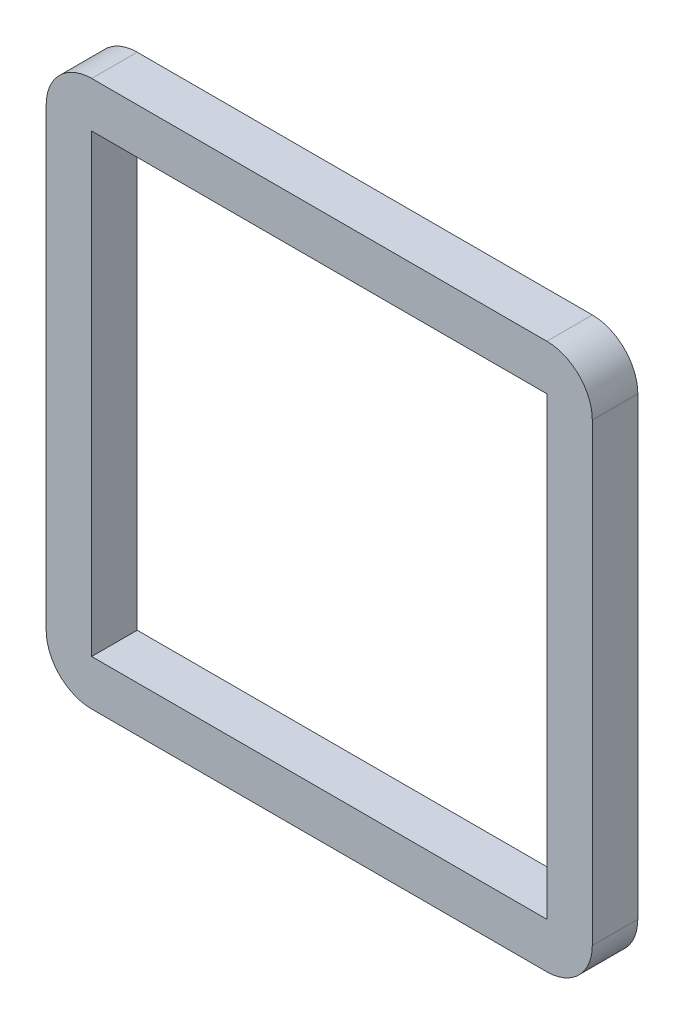
ISO-10303-21;
HEADER;
FILE_DESCRIPTION(('STEP AP214'),'2;1');
FILE_NAME('part.step','',(''),(''),'','','');
FILE_SCHEMA(('AUTOMOTIVE_DESIGN { 1 0 10303 214 1 1 1 1 }'));
ENDSEC;
DATA;
#1=APPLICATION_CONTEXT('core data for automotive mechanical design processes');
#2=APPLICATION_PROTOCOL_DEFINITION('international standard','automotive_design',2000,#1);
#3=PRODUCT_CONTEXT('',#1,'mechanical');
#4=PRODUCT('Part','Part','',(#3));
#5=PRODUCT_RELATED_PRODUCT_CATEGORY('part','',(#4));
#6=PRODUCT_DEFINITION_FORMATION('','',#4);
#7=PRODUCT_DEFINITION_CONTEXT('part definition',#1,'design');
#8=PRODUCT_DEFINITION('design','',#6,#7);
#9=PRODUCT_DEFINITION_SHAPE('','',#8);
#10=(LENGTH_UNIT() NAMED_UNIT(*) SI_UNIT(.MILLI.,.METRE.));
#11=(NAMED_UNIT(*) PLANE_ANGLE_UNIT() SI_UNIT($,.RADIAN.));
#12=(NAMED_UNIT(*) SI_UNIT($,.STERADIAN.) SOLID_ANGLE_UNIT());
#13=UNCERTAINTY_MEASURE_WITH_UNIT(LENGTH_MEASURE(1.E-05),#10,'distance_accuracy_value','');
#14=(GEOMETRIC_REPRESENTATION_CONTEXT(3) GLOBAL_UNCERTAINTY_ASSIGNED_CONTEXT((#13)) GLOBAL_UNIT_ASSIGNED_CONTEXT((#10,
#11,#12)) REPRESENTATION_CONTEXT('',''));
#15=CARTESIAN_POINT('',(0.,0.,0.));
#16=DIRECTION('',(0.,0.,1.));
#17=DIRECTION('',(1.,0.,0.));
#18=AXIS2_PLACEMENT_3D('',#15,#16,#17);
#19=CARTESIAN_POINT('',(-49.9999999999999,60.,10.));
#20=DIRECTION('',(0.,1.,0.));
#21=DIRECTION('',(0.,0.,1.));
#22=AXIS2_PLACEMENT_3D('',#19,#20,#21);
#23=PLANE('',#22);
#24=DIRECTION('',(1.,0.,0.));
#25=VECTOR('',#24,1.);
#26=CARTESIAN_POINT('',(-49.9999999999999,60.,0.));
#27=LINE('',#26,#25);
#28=CARTESIAN_POINT('',(-49.9999999999999,60.,0.));
#29=VERTEX_POINT('',#28);
#30=CARTESIAN_POINT('',(49.9999999999999,60.,0.));
#31=VERTEX_POINT('',#30);
#32=EDGE_CURVE('E155',#29,#31,#27,.T.);
#33=ORIENTED_EDGE('',*,*,#32,.F.);
#34=DIRECTION('',(0.,0.,-1.));
#35=VECTOR('',#34,1.);
#36=CARTESIAN_POINT('',(-49.9999999999999,60.,10.));
#37=LINE('',#36,#35);
#38=CARTESIAN_POINT('',(-49.9999999999999,60.,10.));
#39=VERTEX_POINT('',#38);
#40=EDGE_CURVE('E11',#39,#29,#37,.T.);
#41=ORIENTED_EDGE('',*,*,#40,.F.);
#42=DIRECTION('',(1.,0.,0.));
#43=VECTOR('',#42,1.);
#44=CARTESIAN_POINT('',(-49.9999999999999,60.,10.));
#45=LINE('',#44,#43);
#46=CARTESIAN_POINT('',(49.9999999999999,60.,10.));
#47=VERTEX_POINT('',#46);
#48=EDGE_CURVE('E159',#39,#47,#45,.T.);
#49=ORIENTED_EDGE('',*,*,#48,.T.);
#50=DIRECTION('',(0.,0.,-1.));
#51=VECTOR('',#50,1.);
#52=CARTESIAN_POINT('',(49.9999999999999,60.,10.));
#53=LINE('',#52,#51);
#54=EDGE_CURVE('E36',#47,#31,#53,.T.);
#55=ORIENTED_EDGE('',*,*,#54,.T.);
#56=EDGE_LOOP('',(#33,#41,#49,#55));
#57=FACE_BOUND('',#56,.T.);
#58=ADVANCED_FACE('F33',(#57),#23,.T.);
#59=CARTESIAN_POINT('',(-50.,50.,10.));
#60=DIRECTION('',(0.,0.,-1.));
#61=DIRECTION('',(-1.,0.,0.));
#62=AXIS2_PLACEMENT_3D('',#59,#60,#61);
#63=CYLINDRICAL_SURFACE('',#62,10.);
#64=CARTESIAN_POINT('',(-50.,50.,0.));
#65=DIRECTION('',(0.,0.,1.));
#66=DIRECTION('',(1.,0.,0.));
#67=AXIS2_PLACEMENT_3D('',#64,#65,#66);
#68=CIRCLE('',#67,10.);
#69=CARTESIAN_POINT('',(-60.,49.9999999999999,0.));
#70=VERTEX_POINT('',#69);
#71=EDGE_CURVE('E163',#29,#70,#68,.T.);
#72=ORIENTED_EDGE('',*,*,#71,.T.);
#73=DIRECTION('',(0.,0.,-1.));
#74=VECTOR('',#73,1.);
#75=CARTESIAN_POINT('',(-60.,49.9999999999999,10.));
#76=LINE('',#75,#74);
#77=CARTESIAN_POINT('',(-60.,49.9999999999999,10.));
#78=VERTEX_POINT('',#77);
#79=EDGE_CURVE('E41',#78,#70,#76,.T.);
#80=ORIENTED_EDGE('',*,*,#79,.F.);
#81=CARTESIAN_POINT('',(-50.,50.,10.));
#82=DIRECTION('',(0.,0.,1.));
#83=DIRECTION('',(1.,0.,0.));
#84=AXIS2_PLACEMENT_3D('',#81,#82,#83);
#85=CIRCLE('',#84,10.);
#86=EDGE_CURVE('E177',#39,#78,#85,.T.);
#87=ORIENTED_EDGE('',*,*,#86,.F.);
#88=ORIENTED_EDGE('',*,*,#40,.T.);
#89=EDGE_LOOP('',(#72,#80,#87,#88));
#90=FACE_BOUND('',#89,.T.);
#91=ADVANCED_FACE('F223',(#90),#63,.T.);
#92=CARTESIAN_POINT('',(-60.,49.9999999999999,10.));
#93=DIRECTION('',(1.,0.,0.));
#94=DIRECTION('',(0.,1.,0.));
#95=AXIS2_PLACEMENT_3D('',#92,#93,#94);
#96=PLANE('',#95);
#97=DIRECTION('',(0.,-1.,0.));
#98=VECTOR('',#97,1.);
#99=CARTESIAN_POINT('',(-60.,49.9999999999999,0.));
#100=LINE('',#99,#98);
#101=CARTESIAN_POINT('',(-60.,-49.9999999999999,0.));
#102=VERTEX_POINT('',#101);
#103=EDGE_CURVE('E194',#70,#102,#100,.T.);
#104=ORIENTED_EDGE('',*,*,#103,.T.);
#105=DIRECTION('',(0.,0.,-1.));
#106=VECTOR('',#105,1.);
#107=CARTESIAN_POINT('',(-60.,-49.9999999999999,10.));
#108=LINE('',#107,#106);
#109=CARTESIAN_POINT('',(-60.,-49.9999999999999,10.));
#110=VERTEX_POINT('',#109);
#111=EDGE_CURVE('E199',#110,#102,#108,.T.);
#112=ORIENTED_EDGE('',*,*,#111,.F.);
#113=DIRECTION('',(0.,-1.,0.));
#114=VECTOR('',#113,1.);
#115=CARTESIAN_POINT('',(-60.,49.9999999999999,10.));
#116=LINE('',#115,#114);
#117=EDGE_CURVE('E175',#78,#110,#116,.T.);
#118=ORIENTED_EDGE('',*,*,#117,.F.);
#119=ORIENTED_EDGE('',*,*,#79,.T.);
#120=EDGE_LOOP('',(#104,#112,#118,#119));
#121=FACE_BOUND('',#120,.T.);
#122=ADVANCED_FACE('F227',(#121),#96,.F.);
#123=CARTESIAN_POINT('',(-50.,-50.,10.));
#124=DIRECTION('',(0.,0.,-1.));
#125=DIRECTION('',(-1.,0.,0.));
#126=AXIS2_PLACEMENT_3D('',#123,#124,#125);
#127=CYLINDRICAL_SURFACE('',#126,10.);
#128=CARTESIAN_POINT('',(-50.,-50.,0.));
#129=DIRECTION('',(0.,0.,1.));
#130=DIRECTION('',(1.,0.,0.));
#131=AXIS2_PLACEMENT_3D('',#128,#129,#130);
#132=CIRCLE('',#131,10.);
#133=CARTESIAN_POINT('',(-49.9999999999999,-60.,0.));
#134=VERTEX_POINT('',#133);
#135=EDGE_CURVE('E192',#102,#134,#132,.T.);
#136=ORIENTED_EDGE('',*,*,#135,.T.);
#137=DIRECTION('',(0.,0.,-1.));
#138=VECTOR('',#137,1.);
#139=CARTESIAN_POINT('',(-49.9999999999999,-60.,10.));
#140=LINE('',#139,#138);
#141=CARTESIAN_POINT('',(-49.9999999999999,-60.,10.));
#142=VERTEX_POINT('',#141);
#143=EDGE_CURVE('E202',#142,#134,#140,.T.);
#144=ORIENTED_EDGE('',*,*,#143,.F.);
#145=CARTESIAN_POINT('',(-50.,-50.,10.));
#146=DIRECTION('',(0.,0.,1.));
#147=DIRECTION('',(1.,0.,0.));
#148=AXIS2_PLACEMENT_3D('',#145,#146,#147);
#149=CIRCLE('',#148,10.);
#150=EDGE_CURVE('E173',#110,#142,#149,.T.);
#151=ORIENTED_EDGE('',*,*,#150,.F.);
#152=ORIENTED_EDGE('',*,*,#111,.T.);
#153=EDGE_LOOP('',(#136,#144,#151,#152));
#154=FACE_BOUND('',#153,.T.);
#155=ADVANCED_FACE('F247',(#154),#127,.T.);
#156=CARTESIAN_POINT('',(-49.9999999999999,-60.,10.));
#157=DIRECTION('',(0.,1.,0.));
#158=DIRECTION('',(0.,0.,1.));
#159=AXIS2_PLACEMENT_3D('',#156,#157,#158);
#160=PLANE('',#159);
#161=DIRECTION('',(1.,0.,0.));
#162=VECTOR('',#161,1.);
#163=CARTESIAN_POINT('',(-49.9999999999999,-60.,0.));
#164=LINE('',#163,#162);
#165=CARTESIAN_POINT('',(49.9999999999999,-60.,0.));
#166=VERTEX_POINT('',#165);
#167=EDGE_CURVE('E190',#134,#166,#164,.T.);
#168=ORIENTED_EDGE('',*,*,#167,.T.);
#169=DIRECTION('',(0.,0.,-1.));
#170=VECTOR('',#169,1.);
#171=CARTESIAN_POINT('',(49.9999999999999,-60.,10.));
#172=LINE('',#171,#170);
#173=CARTESIAN_POINT('',(49.9999999999999,-60.,10.));
#174=VERTEX_POINT('',#173);
#175=EDGE_CURVE('E205',#174,#166,#172,.T.);
#176=ORIENTED_EDGE('',*,*,#175,.F.);
#177=DIRECTION('',(1.,0.,0.));
#178=VECTOR('',#177,1.);
#179=CARTESIAN_POINT('',(-49.9999999999999,-60.,10.));
#180=LINE('',#179,#178);
#181=EDGE_CURVE('E171',#142,#174,#180,.T.);
#182=ORIENTED_EDGE('',*,*,#181,.F.);
#183=ORIENTED_EDGE('',*,*,#143,.T.);
#184=EDGE_LOOP('',(#168,#176,#182,#183));
#185=FACE_BOUND('',#184,.T.);
#186=ADVANCED_FACE('F245',(#185),#160,.F.);
#187=CARTESIAN_POINT('',(50.,-50.,10.));
#188=DIRECTION('',(0.,0.,-1.));
#189=DIRECTION('',(-1.,0.,0.));
#190=AXIS2_PLACEMENT_3D('',#187,#188,#189);
#191=CYLINDRICAL_SURFACE('',#190,10.);
#192=CARTESIAN_POINT('',(50.,-50.,0.));
#193=DIRECTION('',(0.,0.,1.));
#194=DIRECTION('',(1.,0.,0.));
#195=AXIS2_PLACEMENT_3D('',#192,#193,#194);
#196=CIRCLE('',#195,10.);
#197=CARTESIAN_POINT('',(60.,-50.,0.));
#198=VERTEX_POINT('',#197);
#199=EDGE_CURVE('E187',#166,#198,#196,.T.);
#200=ORIENTED_EDGE('',*,*,#199,.T.);
#201=DIRECTION('',(0.,0.,-1.));
#202=VECTOR('',#201,1.);
#203=CARTESIAN_POINT('',(60.,-50.,10.));
#204=LINE('',#203,#202);
#205=CARTESIAN_POINT('',(60.,-50.,10.));
#206=VERTEX_POINT('',#205);
#207=EDGE_CURVE('E208',#206,#198,#204,.T.);
#208=ORIENTED_EDGE('',*,*,#207,.F.);
#209=CARTESIAN_POINT('',(50.,-50.,10.));
#210=DIRECTION('',(0.,0.,1.));
#211=DIRECTION('',(1.,0.,0.));
#212=AXIS2_PLACEMENT_3D('',#209,#210,#211);
#213=CIRCLE('',#212,10.);
#214=EDGE_CURVE('E169',#174,#206,#213,.T.);
#215=ORIENTED_EDGE('',*,*,#214,.F.);
#216=ORIENTED_EDGE('',*,*,#175,.T.);
#217=EDGE_LOOP('',(#200,#208,#215,#216));
#218=FACE_BOUND('',#217,.T.);
#219=ADVANCED_FACE('F241',(#218),#191,.T.);
#220=CARTESIAN_POINT('',(60.,49.9999999999999,10.));
#221=DIRECTION('',(1.,0.,0.));
#222=DIRECTION('',(0.,1.,0.));
#223=AXIS2_PLACEMENT_3D('',#220,#221,#222);
#224=PLANE('',#223);
#225=DIRECTION('',(0.,-1.,0.));
#226=VECTOR('',#225,1.);
#227=CARTESIAN_POINT('',(60.,49.9999999999999,0.));
#228=LINE('',#227,#226);
#229=CARTESIAN_POINT('',(60.,49.9999999999999,0.));
#230=VERTEX_POINT('',#229);
#231=EDGE_CURVE('E184',#230,#198,#228,.T.);
#232=ORIENTED_EDGE('',*,*,#231,.F.);
#233=DIRECTION('',(0.,0.,-1.));
#234=VECTOR('',#233,1.);
#235=CARTESIAN_POINT('',(60.,49.9999999999999,10.));
#236=LINE('',#235,#234);
#237=CARTESIAN_POINT('',(60.,49.9999999999999,10.));
#238=VERTEX_POINT('',#237);
#239=EDGE_CURVE('E209',#238,#230,#236,.T.);
#240=ORIENTED_EDGE('',*,*,#239,.F.);
#241=DIRECTION('',(0.,-1.,0.));
#242=VECTOR('',#241,1.);
#243=CARTESIAN_POINT('',(60.,49.9999999999999,10.));
#244=LINE('',#243,#242);
#245=EDGE_CURVE('E166',#238,#206,#244,.T.);
#246=ORIENTED_EDGE('',*,*,#245,.T.);
#247=ORIENTED_EDGE('',*,*,#207,.T.);
#248=EDGE_LOOP('',(#232,#240,#246,#247));
#249=FACE_BOUND('',#248,.T.);
#250=ADVANCED_FACE('F237',(#249),#224,.T.);
#251=CARTESIAN_POINT('',(50.,50.,10.));
#252=DIRECTION('',(0.,0.,-1.));
#253=DIRECTION('',(-1.,0.,0.));
#254=AXIS2_PLACEMENT_3D('',#251,#252,#253);
#255=CYLINDRICAL_SURFACE('',#254,10.);
#256=CARTESIAN_POINT('',(50.,50.,0.));
#257=DIRECTION('',(0.,0.,-1.));
#258=DIRECTION('',(-1.,0.,0.));
#259=AXIS2_PLACEMENT_3D('',#256,#257,#258);
#260=CIRCLE('',#259,10.);
#261=EDGE_CURVE('E181',#31,#230,#260,.T.);
#262=ORIENTED_EDGE('',*,*,#261,.F.);
#263=ORIENTED_EDGE('',*,*,#54,.F.);
#264=CARTESIAN_POINT('',(50.,50.,10.));
#265=DIRECTION('',(0.,0.,-1.));
#266=DIRECTION('',(-1.,0.,0.));
#267=AXIS2_PLACEMENT_3D('',#264,#265,#266);
#268=CIRCLE('',#267,10.);
#269=EDGE_CURVE('E162',#47,#238,#268,.T.);
#270=ORIENTED_EDGE('',*,*,#269,.T.);
#271=ORIENTED_EDGE('',*,*,#239,.T.);
#272=EDGE_LOOP('',(#262,#263,#270,#271));
#273=FACE_BOUND('',#272,.T.);
#274=ADVANCED_FACE('F217',(#273),#255,.T.);
#275=CARTESIAN_POINT('',(50.,50.,10.));
#276=DIRECTION('',(0.,0.,-1.));
#277=DIRECTION('',(-1.,0.,0.));
#278=AXIS2_PLACEMENT_3D('',#275,#276,#277);
#279=PLANE('',#278);
#280=DIRECTION('',(-1.,0.,0.));
#281=VECTOR('',#280,1.);
#282=CARTESIAN_POINT('',(-50.,50.,10.));
#283=LINE('',#282,#281);
#284=CARTESIAN_POINT('',(50.,50.,10.));
#285=VERTEX_POINT('',#284);
#286=CARTESIAN_POINT('',(-50.,50.,10.));
#287=VERTEX_POINT('',#286);
#288=EDGE_CURVE('E149',#285,#287,#283,.T.);
#289=ORIENTED_EDGE('',*,*,#288,.F.);
#290=DIRECTION('',(0.,1.,0.));
#291=VECTOR('',#290,1.);
#292=CARTESIAN_POINT('',(50.,50.,10.));
#293=LINE('',#292,#291);
#294=CARTESIAN_POINT('',(50.,-50.,10.));
#295=VERTEX_POINT('',#294);
#296=EDGE_CURVE('E49',#295,#285,#293,.T.);
#297=ORIENTED_EDGE('',*,*,#296,.F.);
#298=DIRECTION('',(1.,0.,0.));
#299=VECTOR('',#298,1.);
#300=CARTESIAN_POINT('',(-50.,-50.,10.));
#301=LINE('',#300,#299);
#302=CARTESIAN_POINT('',(-50.,-50.,10.));
#303=VERTEX_POINT('',#302);
#304=EDGE_CURVE('E140',#303,#295,#301,.T.);
#305=ORIENTED_EDGE('',*,*,#304,.F.);
#306=DIRECTION('',(0.,-1.,0.));
#307=VECTOR('',#306,1.);
#308=CARTESIAN_POINT('',(-50.,50.,10.));
#309=LINE('',#308,#307);
#310=EDGE_CURVE('E143',#287,#303,#309,.T.);
#311=ORIENTED_EDGE('',*,*,#310,.F.);
#312=EDGE_LOOP('',(#289,#297,#305,#311));
#313=FACE_BOUND('',#312,.T.);
#314=ORIENTED_EDGE('',*,*,#48,.F.);
#315=ORIENTED_EDGE('',*,*,#86,.T.);
#316=ORIENTED_EDGE('',*,*,#117,.T.);
#317=ORIENTED_EDGE('',*,*,#150,.T.);
#318=ORIENTED_EDGE('',*,*,#181,.T.);
#319=ORIENTED_EDGE('',*,*,#214,.T.);
#320=ORIENTED_EDGE('',*,*,#245,.F.);
#321=ORIENTED_EDGE('',*,*,#269,.F.);
#322=EDGE_LOOP('',(#314,#315,#316,#317,#318,#319,#320,#321));
#323=FACE_BOUND('',#322,.T.);
#324=ADVANCED_FACE('F231',(#313,#323),#279,.F.);
#325=CARTESIAN_POINT('',(50.,50.,0.));
#326=DIRECTION('',(0.,0.,-1.));
#327=DIRECTION('',(-1.,0.,0.));
#328=AXIS2_PLACEMENT_3D('',#325,#326,#327);
#329=PLANE('',#328);
#330=DIRECTION('',(0.,1.,0.));
#331=VECTOR('',#330,1.);
#332=CARTESIAN_POINT('',(50.,50.,0.));
#333=LINE('',#332,#331);
#334=CARTESIAN_POINT('',(50.,-50.,0.));
#335=VERTEX_POINT('',#334);
#336=CARTESIAN_POINT('',(50.,50.,0.));
#337=VERTEX_POINT('',#336);
#338=EDGE_CURVE('E124',#335,#337,#333,.T.);
#339=ORIENTED_EDGE('',*,*,#338,.T.);
#340=DIRECTION('',(-1.,0.,0.));
#341=VECTOR('',#340,1.);
#342=CARTESIAN_POINT('',(-50.,50.,0.));
#343=LINE('',#342,#341);
#344=CARTESIAN_POINT('',(-50.,50.,0.));
#345=VERTEX_POINT('',#344);
#346=EDGE_CURVE('E133',#337,#345,#343,.T.);
#347=ORIENTED_EDGE('',*,*,#346,.T.);
#348=DIRECTION('',(0.,-1.,0.));
#349=VECTOR('',#348,1.);
#350=CARTESIAN_POINT('',(-50.,50.,0.));
#351=LINE('',#350,#349);
#352=CARTESIAN_POINT('',(-50.,-50.,0.));
#353=VERTEX_POINT('',#352);
#354=EDGE_CURVE('E57',#345,#353,#351,.T.);
#355=ORIENTED_EDGE('',*,*,#354,.T.);
#356=DIRECTION('',(1.,0.,0.));
#357=VECTOR('',#356,1.);
#358=CARTESIAN_POINT('',(-50.,-50.,0.));
#359=LINE('',#358,#357);
#360=EDGE_CURVE('E130',#353,#335,#359,.T.);
#361=ORIENTED_EDGE('',*,*,#360,.T.);
#362=EDGE_LOOP('',(#339,#347,#355,#361));
#363=FACE_BOUND('',#362,.T.);
#364=ORIENTED_EDGE('',*,*,#32,.T.);
#365=ORIENTED_EDGE('',*,*,#261,.T.);
#366=ORIENTED_EDGE('',*,*,#231,.T.);
#367=ORIENTED_EDGE('',*,*,#199,.F.);
#368=ORIENTED_EDGE('',*,*,#167,.F.);
#369=ORIENTED_EDGE('',*,*,#135,.F.);
#370=ORIENTED_EDGE('',*,*,#103,.F.);
#371=ORIENTED_EDGE('',*,*,#71,.F.);
#372=EDGE_LOOP('',(#364,#365,#366,#367,#368,#369,#370,#371));
#373=FACE_BOUND('',#372,.T.);
#374=ADVANCED_FACE('F137',(#363,#373),#329,.T.);
#375=CARTESIAN_POINT('',(50.,50.,0.));
#376=DIRECTION('',(1.,0.,0.));
#377=DIRECTION('',(0.,0.,-1.));
#378=AXIS2_PLACEMENT_3D('',#375,#376,#377);
#379=PLANE('',#378);
#380=ORIENTED_EDGE('',*,*,#296,.T.);
#381=DIRECTION('',(0.,0.,1.));
#382=VECTOR('',#381,1.);
#383=CARTESIAN_POINT('',(50.,50.,0.));
#384=LINE('',#383,#382);
#385=EDGE_CURVE('E120',#337,#285,#384,.T.);
#386=ORIENTED_EDGE('',*,*,#385,.F.);
#387=ORIENTED_EDGE('',*,*,#338,.F.);
#388=DIRECTION('',(0.,0.,1.));
#389=VECTOR('',#388,1.);
#390=CARTESIAN_POINT('',(50.,-50.,0.));
#391=LINE('',#390,#389);
#392=EDGE_CURVE('E153',#335,#295,#391,.T.);
#393=ORIENTED_EDGE('',*,*,#392,.T.);
#394=EDGE_LOOP('',(#380,#386,#387,#393));
#395=FACE_BOUND('',#394,.T.);
#396=ADVANCED_FACE('F122',(#395),#379,.F.);
#397=CARTESIAN_POINT('',(-50.,-50.,0.));
#398=DIRECTION('',(0.,-1.,0.));
#399=DIRECTION('',(0.,0.,-1.));
#400=AXIS2_PLACEMENT_3D('',#397,#398,#399);
#401=PLANE('',#400);
#402=ORIENTED_EDGE('',*,*,#304,.T.);
#403=ORIENTED_EDGE('',*,*,#392,.F.);
#404=ORIENTED_EDGE('',*,*,#360,.F.);
#405=DIRECTION('',(0.,0.,1.));
#406=VECTOR('',#405,1.);
#407=CARTESIAN_POINT('',(-50.,-50.,0.));
#408=LINE('',#407,#406);
#409=EDGE_CURVE('E156',#353,#303,#408,.T.);
#410=ORIENTED_EDGE('',*,*,#409,.T.);
#411=EDGE_LOOP('',(#402,#403,#404,#410));
#412=FACE_BOUND('',#411,.T.);
#413=ADVANCED_FACE('F271',(#412),#401,.F.);
#414=CARTESIAN_POINT('',(-50.,50.,0.));
#415=DIRECTION('',(-1.,0.,0.));
#416=DIRECTION('',(0.,0.,1.));
#417=AXIS2_PLACEMENT_3D('',#414,#415,#416);
#418=PLANE('',#417);
#419=ORIENTED_EDGE('',*,*,#310,.T.);
#420=ORIENTED_EDGE('',*,*,#409,.F.);
#421=ORIENTED_EDGE('',*,*,#354,.F.);
#422=DIRECTION('',(0.,0.,1.));
#423=VECTOR('',#422,1.);
#424=CARTESIAN_POINT('',(-50.,50.,0.));
#425=LINE('',#424,#423);
#426=EDGE_CURVE('E129',#345,#287,#425,.T.);
#427=ORIENTED_EDGE('',*,*,#426,.T.);
#428=EDGE_LOOP('',(#419,#420,#421,#427));
#429=FACE_BOUND('',#428,.T.);
#430=ADVANCED_FACE('F274',(#429),#418,.F.);
#431=CARTESIAN_POINT('',(-50.,50.,0.));
#432=DIRECTION('',(0.,1.,0.));
#433=DIRECTION('',(0.,0.,1.));
#434=AXIS2_PLACEMENT_3D('',#431,#432,#433);
#435=PLANE('',#434);
#436=ORIENTED_EDGE('',*,*,#288,.T.);
#437=ORIENTED_EDGE('',*,*,#426,.F.);
#438=ORIENTED_EDGE('',*,*,#346,.F.);
#439=ORIENTED_EDGE('',*,*,#385,.T.);
#440=EDGE_LOOP('',(#436,#437,#438,#439));
#441=FACE_BOUND('',#440,.T.);
#442=ADVANCED_FACE('F134',(#441),#435,.F.);
#443=CLOSED_SHELL('',(#58,#91,#122,#155,#186,#219,#250,#274,#324,#374,#396,#413,#430,#442));
#444=MANIFOLD_SOLID_BREP('B2',#443);
#445=ADVANCED_BREP_SHAPE_REPRESENTATION('',(#18,#444),#14);
#446=SHAPE_DEFINITION_REPRESENTATION(#9,#445);
ENDSEC;
END-ISO-10303-21;
